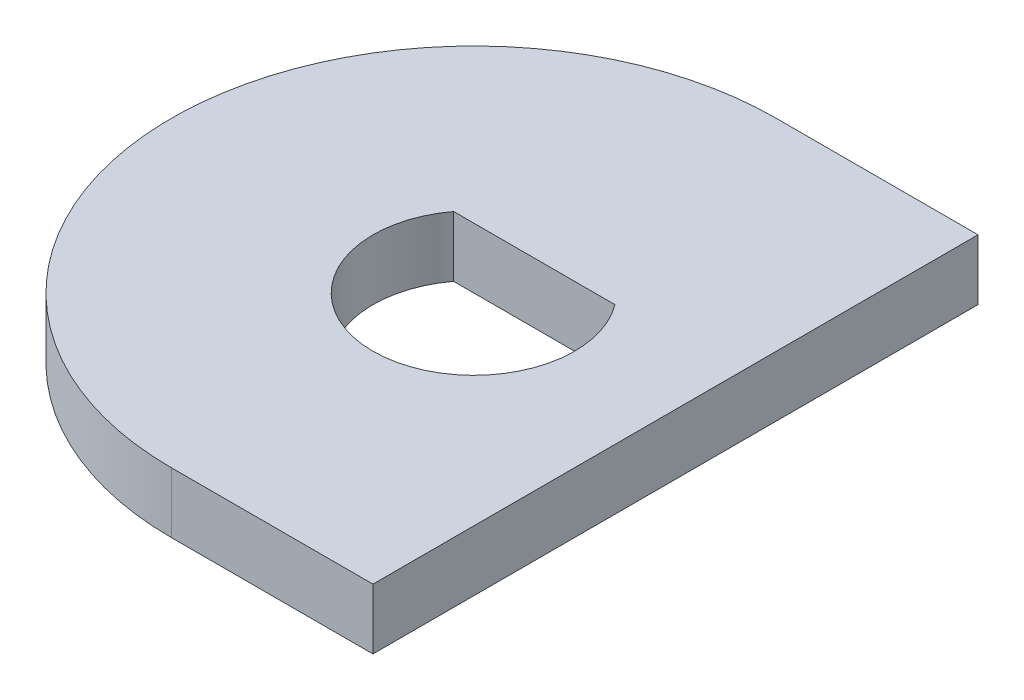
ISO-10303-21;
HEADER;
FILE_DESCRIPTION(('STEP AP214'),'2;1');
FILE_NAME('part.step','',(''),(''),'','','');
FILE_SCHEMA(('AUTOMOTIVE_DESIGN { 1 0 10303 214 1 1 1 1 }'));
ENDSEC;
DATA;
#1=APPLICATION_CONTEXT('core data for automotive mechanical design processes');
#2=APPLICATION_PROTOCOL_DEFINITION('international standard','automotive_design',2000,#1);
#3=PRODUCT_CONTEXT('',#1,'mechanical');
#4=PRODUCT('Part','Part','',(#3));
#5=PRODUCT_RELATED_PRODUCT_CATEGORY('part','',(#4));
#6=PRODUCT_DEFINITION_FORMATION('','',#4);
#7=PRODUCT_DEFINITION_CONTEXT('part definition',#1,'design');
#8=PRODUCT_DEFINITION('design','',#6,#7);
#9=PRODUCT_DEFINITION_SHAPE('','',#8);
#10=(LENGTH_UNIT() NAMED_UNIT(*) SI_UNIT(.MILLI.,.METRE.));
#11=(NAMED_UNIT(*) PLANE_ANGLE_UNIT() SI_UNIT($,.RADIAN.));
#12=(NAMED_UNIT(*) SI_UNIT($,.STERADIAN.) SOLID_ANGLE_UNIT());
#13=UNCERTAINTY_MEASURE_WITH_UNIT(LENGTH_MEASURE(1.E-05),#10,'distance_accuracy_value','');
#14=(GEOMETRIC_REPRESENTATION_CONTEXT(3) GLOBAL_UNCERTAINTY_ASSIGNED_CONTEXT((#13)) GLOBAL_UNIT_ASSIGNED_CONTEXT((#10,
#11,#12)) REPRESENTATION_CONTEXT('',''));
#15=CARTESIAN_POINT('',(0.,0.,0.));
#16=DIRECTION('',(0.,0.,1.));
#17=DIRECTION('',(1.,0.,0.));
#18=AXIS2_PLACEMENT_3D('',#15,#16,#17);
#19=CARTESIAN_POINT('',(0.,3.,-23.8916907708611));
#20=DIRECTION('',(0.,0.,-1.));
#21=DIRECTION('',(-1.,0.,0.));
#22=AXIS2_PLACEMENT_3D('',#19,#20,#21);
#23=PLANE('',#22);
#24=DIRECTION('',(1.,0.,0.));
#25=VECTOR('',#24,1.);
#26=CARTESIAN_POINT('',(0.,0.,-23.8916907708611));
#27=LINE('',#26,#25);
#28=CARTESIAN_POINT('',(-3.04722020145324,0.,-23.8916907708611));
#29=VERTEX_POINT('',#28);
#30=CARTESIAN_POINT('',(6.95277979854676,0.,-23.8916907708611));
#31=VERTEX_POINT('',#30);
#32=EDGE_CURVE('E135',#29,#31,#27,.T.);
#33=ORIENTED_EDGE('',*,*,#32,.F.);
#34=DIRECTION('',(0.,-1.,0.));
#35=VECTOR('',#34,1.);
#36=CARTESIAN_POINT('',(-3.04722020145324,3.,-23.8916907708611));
#37=LINE('',#36,#35);
#38=CARTESIAN_POINT('',(-3.04722020145324,3.,-23.8916907708611));
#39=VERTEX_POINT('',#38);
#40=EDGE_CURVE('E11',#39,#29,#37,.T.);
#41=ORIENTED_EDGE('',*,*,#40,.F.);
#42=DIRECTION('',(1.,0.,0.));
#43=VECTOR('',#42,1.);
#44=CARTESIAN_POINT('',(0.,3.,-23.8916907708611));
#45=LINE('',#44,#43);
#46=CARTESIAN_POINT('',(6.95277979854676,3.,-23.8916907708611));
#47=VERTEX_POINT('',#46);
#48=EDGE_CURVE('E116',#39,#47,#45,.T.);
#49=ORIENTED_EDGE('',*,*,#48,.T.);
#50=DIRECTION('',(0.,-1.,0.));
#51=VECTOR('',#50,1.);
#52=CARTESIAN_POINT('',(6.95277979854676,3.,-23.8916907708611));
#53=LINE('',#52,#51);
#54=EDGE_CURVE('E88',#47,#31,#53,.T.);
#55=ORIENTED_EDGE('',*,*,#54,.T.);
#56=EDGE_LOOP('',(#33,#41,#49,#55));
#57=FACE_BOUND('',#56,.T.);
#58=ADVANCED_FACE('F41',(#57),#23,.T.);
#59=CARTESIAN_POINT('',(-3.04722020145324,3.,-8.89169077086112));
#60=DIRECTION('',(0.,-1.,0.));
#61=DIRECTION('',(0.,0.,-1.));
#62=AXIS2_PLACEMENT_3D('',#59,#60,#61);
#63=CYLINDRICAL_SURFACE('',#62,15.);
#64=CARTESIAN_POINT('',(-3.04722020145324,0.,-8.89169077086112));
#65=DIRECTION('',(0.,1.,0.));
#66=DIRECTION('',(0.,0.,1.));
#67=AXIS2_PLACEMENT_3D('',#64,#65,#66);
#68=CIRCLE('',#67,15.);
#69=CARTESIAN_POINT('',(-3.04722020145324,0.,6.10830922913888));
#70=VERTEX_POINT('',#69);
#71=EDGE_CURVE('E121',#29,#70,#68,.T.);
#72=ORIENTED_EDGE('',*,*,#71,.T.);
#73=DIRECTION('',(0.,-1.,0.));
#74=VECTOR('',#73,1.);
#75=CARTESIAN_POINT('',(-3.04722020145324,3.,6.10830922913888));
#76=LINE('',#75,#74);
#77=CARTESIAN_POINT('',(-3.04722020145324,3.,6.10830922913888));
#78=VERTEX_POINT('',#77);
#79=EDGE_CURVE('E51',#78,#70,#76,.T.);
#80=ORIENTED_EDGE('',*,*,#79,.F.);
#81=CARTESIAN_POINT('',(-3.04722020145324,3.,-8.89169077086112));
#82=DIRECTION('',(0.,1.,0.));
#83=DIRECTION('',(0.,0.,1.));
#84=AXIS2_PLACEMENT_3D('',#81,#82,#83);
#85=CIRCLE('',#84,15.);
#86=EDGE_CURVE('E112',#39,#78,#85,.T.);
#87=ORIENTED_EDGE('',*,*,#86,.F.);
#88=ORIENTED_EDGE('',*,*,#40,.T.);
#89=EDGE_LOOP('',(#72,#80,#87,#88));
#90=FACE_BOUND('',#89,.T.);
#91=ADVANCED_FACE('F119',(#90),#63,.T.);
#92=CARTESIAN_POINT('',(0.,3.,6.10830922913888));
#93=DIRECTION('',(0.,0.,-1.));
#94=DIRECTION('',(-1.,0.,0.));
#95=AXIS2_PLACEMENT_3D('',#92,#93,#94);
#96=PLANE('',#95);
#97=DIRECTION('',(1.,0.,0.));
#98=VECTOR('',#97,1.);
#99=CARTESIAN_POINT('',(0.,0.,6.10830922913888));
#100=LINE('',#99,#98);
#101=CARTESIAN_POINT('',(6.95277979854676,0.,6.10830922913888));
#102=VERTEX_POINT('',#101);
#103=EDGE_CURVE('E138',#70,#102,#100,.T.);
#104=ORIENTED_EDGE('',*,*,#103,.T.);
#105=DIRECTION('',(0.,-1.,0.));
#106=VECTOR('',#105,1.);
#107=CARTESIAN_POINT('',(6.95277979854676,3.,6.10830922913888));
#108=LINE('',#107,#106);
#109=CARTESIAN_POINT('',(6.95277979854676,3.,6.10830922913888));
#110=VERTEX_POINT('',#109);
#111=EDGE_CURVE('E111',#110,#102,#108,.T.);
#112=ORIENTED_EDGE('',*,*,#111,.F.);
#113=DIRECTION('',(1.,0.,0.));
#114=VECTOR('',#113,1.);
#115=CARTESIAN_POINT('',(0.,3.,6.10830922913888));
#116=LINE('',#115,#114);
#117=EDGE_CURVE('E105',#78,#110,#116,.T.);
#118=ORIENTED_EDGE('',*,*,#117,.F.);
#119=ORIENTED_EDGE('',*,*,#79,.T.);
#120=EDGE_LOOP('',(#104,#112,#118,#119));
#121=FACE_BOUND('',#120,.T.);
#122=ADVANCED_FACE('F108',(#121),#96,.F.);
#123=CARTESIAN_POINT('',(-3.04722020145324,3.,-8.89169077086112));
#124=DIRECTION('',(0.,-1.,0.));
#125=DIRECTION('',(0.,0.,-1.));
#126=AXIS2_PLACEMENT_3D('',#123,#124,#125);
#127=CYLINDRICAL_SURFACE('',#126,5.);
#128=CARTESIAN_POINT('',(-3.04722020145324,0.,-8.89169077086112));
#129=DIRECTION('',(0.,1.,0.));
#130=DIRECTION('',(0.,0.,1.));
#131=AXIS2_PLACEMENT_3D('',#128,#129,#130);
#132=CIRCLE('',#131,5.);
#133=CARTESIAN_POINT('',(-7.04722020145324,0.,-11.8916907708611));
#134=VERTEX_POINT('',#133);
#135=CARTESIAN_POINT('',(0.95277979854676,0.,-11.8916907708611));
#136=VERTEX_POINT('',#135);
#137=EDGE_CURVE('E130',#134,#136,#132,.T.);
#138=ORIENTED_EDGE('',*,*,#137,.F.);
#139=DIRECTION('',(0.,-1.,0.));
#140=VECTOR('',#139,1.);
#141=CARTESIAN_POINT('',(-7.04722020145324,3.,-11.8916907708611));
#142=LINE('',#141,#140);
#143=CARTESIAN_POINT('',(-7.04722020145324,3.,-11.8916907708611));
#144=VERTEX_POINT('',#143);
#145=EDGE_CURVE('E45',#144,#134,#142,.T.);
#146=ORIENTED_EDGE('',*,*,#145,.F.);
#147=CARTESIAN_POINT('',(-3.04722020145324,3.,-8.89169077086112));
#148=DIRECTION('',(0.,1.,0.));
#149=DIRECTION('',(0.,0.,1.));
#150=AXIS2_PLACEMENT_3D('',#147,#148,#149);
#151=CIRCLE('',#150,5.);
#152=CARTESIAN_POINT('',(0.95277979854676,3.,-11.8916907708611));
#153=VERTEX_POINT('',#152);
#154=EDGE_CURVE('E140',#144,#153,#151,.T.);
#155=ORIENTED_EDGE('',*,*,#154,.T.);
#156=DIRECTION('',(0.,-1.,0.));
#157=VECTOR('',#156,1.);
#158=CARTESIAN_POINT('',(0.95277979854676,3.,-11.8916907708611));
#159=LINE('',#158,#157);
#160=EDGE_CURVE('E125',#153,#136,#159,.T.);
#161=ORIENTED_EDGE('',*,*,#160,.T.);
#162=EDGE_LOOP('',(#138,#146,#155,#161));
#163=FACE_BOUND('',#162,.T.);
#164=ADVANCED_FACE('F43',(#163),#127,.F.);
#165=CARTESIAN_POINT('',(0.,3.,-11.8916907708611));
#166=DIRECTION('',(0.,0.,-1.));
#167=DIRECTION('',(-1.,0.,0.));
#168=AXIS2_PLACEMENT_3D('',#165,#166,#167);
#169=PLANE('',#168);
#170=DIRECTION('',(1.,0.,0.));
#171=VECTOR('',#170,1.);
#172=CARTESIAN_POINT('',(0.,0.,-11.8916907708611));
#173=LINE('',#172,#171);
#174=EDGE_CURVE('E133',#134,#136,#173,.T.);
#175=ORIENTED_EDGE('',*,*,#174,.T.);
#176=ORIENTED_EDGE('',*,*,#160,.F.);
#177=DIRECTION('',(1.,0.,0.));
#178=VECTOR('',#177,1.);
#179=CARTESIAN_POINT('',(0.,3.,-11.8916907708611));
#180=LINE('',#179,#178);
#181=EDGE_CURVE('E142',#144,#153,#180,.T.);
#182=ORIENTED_EDGE('',*,*,#181,.F.);
#183=ORIENTED_EDGE('',*,*,#145,.T.);
#184=EDGE_LOOP('',(#175,#176,#182,#183));
#185=FACE_BOUND('',#184,.T.);
#186=ADVANCED_FACE('F165',(#185),#169,.F.);
#187=CARTESIAN_POINT('',(6.95277979854676,3.,0.));
#188=DIRECTION('',(-1.,0.,0.));
#189=DIRECTION('',(0.,0.,1.));
#190=AXIS2_PLACEMENT_3D('',#187,#188,#189);
#191=PLANE('',#190);
#192=DIRECTION('',(0.,0.,-1.));
#193=VECTOR('',#192,1.);
#194=CARTESIAN_POINT('',(6.95277979854676,0.,0.));
#195=LINE('',#194,#193);
#196=EDGE_CURVE('E81',#102,#31,#195,.T.);
#197=ORIENTED_EDGE('',*,*,#196,.T.);
#198=ORIENTED_EDGE('',*,*,#54,.F.);
#199=DIRECTION('',(0.,0.,-1.));
#200=VECTOR('',#199,1.);
#201=CARTESIAN_POINT('',(6.95277979854676,3.,0.));
#202=LINE('',#201,#200);
#203=EDGE_CURVE('E60',#110,#47,#202,.T.);
#204=ORIENTED_EDGE('',*,*,#203,.F.);
#205=ORIENTED_EDGE('',*,*,#111,.T.);
#206=EDGE_LOOP('',(#197,#198,#204,#205));
#207=FACE_BOUND('',#206,.T.);
#208=ADVANCED_FACE('F154',(#207),#191,.F.);
#209=CARTESIAN_POINT('',(0.,3.,0.));
#210=DIRECTION('',(0.,1.,0.));
#211=DIRECTION('',(0.,0.,1.));
#212=AXIS2_PLACEMENT_3D('',#209,#210,#211);
#213=PLANE('',#212);
#214=ORIENTED_EDGE('',*,*,#154,.F.);
#215=ORIENTED_EDGE('',*,*,#181,.T.);
#216=EDGE_LOOP('',(#214,#215));
#217=FACE_BOUND('',#216,.T.);
#218=ORIENTED_EDGE('',*,*,#48,.F.);
#219=ORIENTED_EDGE('',*,*,#86,.T.);
#220=ORIENTED_EDGE('',*,*,#117,.T.);
#221=ORIENTED_EDGE('',*,*,#203,.T.);
#222=EDGE_LOOP('',(#218,#219,#220,#221));
#223=FACE_BOUND('',#222,.T.);
#224=ADVANCED_FACE('F115',(#217,#223),#213,.T.);
#225=CARTESIAN_POINT('',(0.,0.,0.));
#226=DIRECTION('',(0.,1.,0.));
#227=DIRECTION('',(0.,0.,1.));
#228=AXIS2_PLACEMENT_3D('',#225,#226,#227);
#229=PLANE('',#228);
#230=ORIENTED_EDGE('',*,*,#137,.T.);
#231=ORIENTED_EDGE('',*,*,#174,.F.);
#232=EDGE_LOOP('',(#230,#231));
#233=FACE_BOUND('',#232,.T.);
#234=ORIENTED_EDGE('',*,*,#32,.T.);
#235=ORIENTED_EDGE('',*,*,#196,.F.);
#236=ORIENTED_EDGE('',*,*,#103,.F.);
#237=ORIENTED_EDGE('',*,*,#71,.F.);
#238=EDGE_LOOP('',(#234,#235,#236,#237));
#239=FACE_BOUND('',#238,.T.);
#240=ADVANCED_FACE('F147',(#233,#239),#229,.F.);
#241=CLOSED_SHELL('',(#58,#91,#122,#164,#186,#208,#224,#240));
#242=MANIFOLD_SOLID_BREP('B2',#241);
#243=ADVANCED_BREP_SHAPE_REPRESENTATION('',(#18,#242),#14);
#244=SHAPE_DEFINITION_REPRESENTATION(#9,#243);
ENDSEC;
END-ISO-10303-21;
